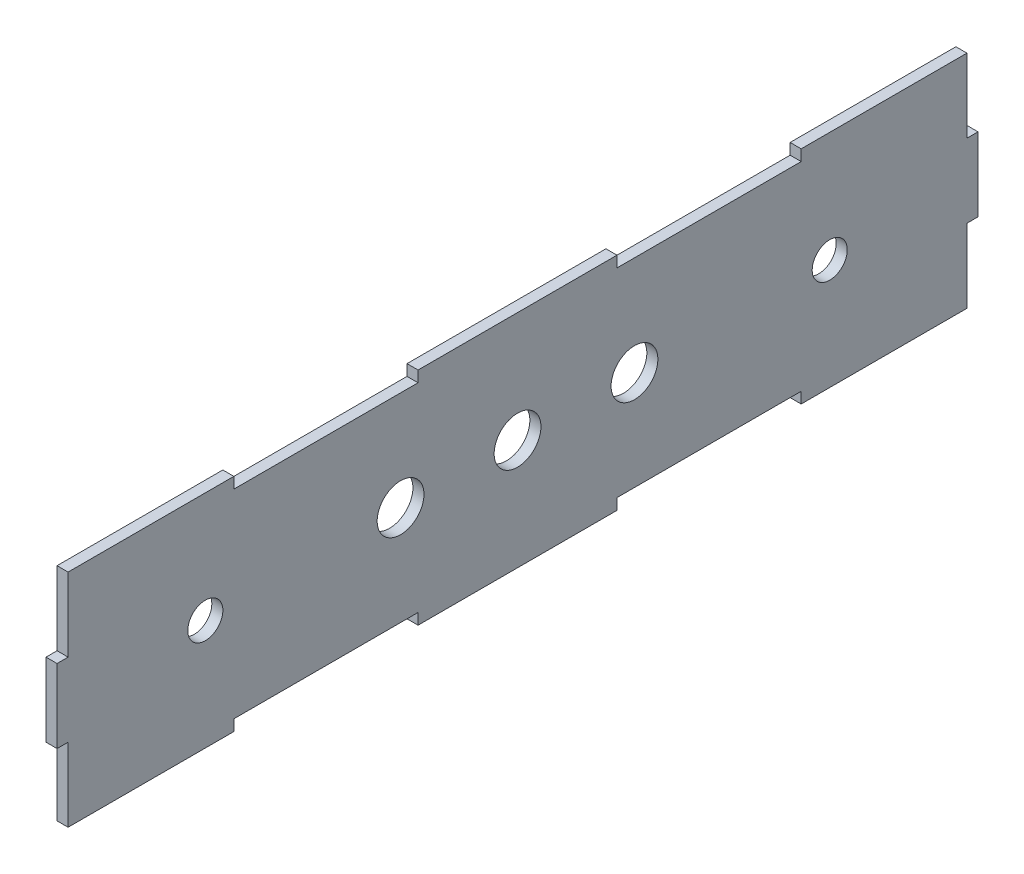
ISO-10303-21;
HEADER;
FILE_DESCRIPTION(('STEP AP214'),'2;1');
FILE_NAME('part.step','',(''),(''),'','','');
FILE_SCHEMA(('AUTOMOTIVE_DESIGN { 1 0 10303 214 1 1 1 1 }'));
ENDSEC;
DATA;
#1=APPLICATION_CONTEXT('core data for automotive mechanical design processes');
#2=APPLICATION_PROTOCOL_DEFINITION('international standard','automotive_design',2000,#1);
#3=PRODUCT_CONTEXT('',#1,'mechanical');
#4=PRODUCT('Part','Part','',(#3));
#5=PRODUCT_RELATED_PRODUCT_CATEGORY('part','',(#4));
#6=PRODUCT_DEFINITION_FORMATION('','',#4);
#7=PRODUCT_DEFINITION_CONTEXT('part definition',#1,'design');
#8=PRODUCT_DEFINITION('design','',#6,#7);
#9=PRODUCT_DEFINITION_SHAPE('','',#8);
#10=(LENGTH_UNIT() NAMED_UNIT(*) SI_UNIT(.MILLI.,.METRE.));
#11=(NAMED_UNIT(*) PLANE_ANGLE_UNIT() SI_UNIT($,.RADIAN.));
#12=(NAMED_UNIT(*) SI_UNIT($,.STERADIAN.) SOLID_ANGLE_UNIT());
#13=UNCERTAINTY_MEASURE_WITH_UNIT(LENGTH_MEASURE(1.E-05),#10,'distance_accuracy_value','');
#14=(GEOMETRIC_REPRESENTATION_CONTEXT(3) GLOBAL_UNCERTAINTY_ASSIGNED_CONTEXT((#13)) GLOBAL_UNIT_ASSIGNED_CONTEXT((#10,
#11,#12)) REPRESENTATION_CONTEXT('',''));
#15=CARTESIAN_POINT('',(0.,0.,0.));
#16=DIRECTION('',(0.,0.,1.));
#17=DIRECTION('',(1.,0.,0.));
#18=AXIS2_PLACEMENT_3D('',#15,#16,#17);
#19=CARTESIAN_POINT('',(3.,0.,27.));
#20=DIRECTION('',(0.,0.,-1.));
#21=DIRECTION('',(-1.,0.,0.));
#22=AXIS2_PLACEMENT_3D('',#19,#20,#21);
#23=PLANE('',#22);
#24=DIRECTION('',(0.,-1.,0.));
#25=VECTOR('',#24,1.);
#26=CARTESIAN_POINT('',(0.,0.,27.));
#27=LINE('',#26,#25);
#28=CARTESIAN_POINT('',(0.,-27.,27.));
#29=VERTEX_POINT('',#28);
#30=CARTESIAN_POINT('',(0.,-30.,27.));
#31=VERTEX_POINT('',#30);
#32=EDGE_CURVE('E262',#29,#31,#27,.T.);
#33=ORIENTED_EDGE('',*,*,#32,.T.);
#34=DIRECTION('',(-1.,0.,0.));
#35=VECTOR('',#34,1.);
#36=CARTESIAN_POINT('',(3.,-30.,27.));
#37=LINE('',#36,#35);
#38=CARTESIAN_POINT('',(3.,-30.,27.));
#39=VERTEX_POINT('',#38);
#40=EDGE_CURVE('E11',#39,#31,#37,.T.);
#41=ORIENTED_EDGE('',*,*,#40,.F.);
#42=DIRECTION('',(0.,-1.,0.));
#43=VECTOR('',#42,1.);
#44=CARTESIAN_POINT('',(3.,0.,27.));
#45=LINE('',#44,#43);
#46=CARTESIAN_POINT('',(3.,-27.,27.));
#47=VERTEX_POINT('',#46);
#48=EDGE_CURVE('E362',#47,#39,#45,.T.);
#49=ORIENTED_EDGE('',*,*,#48,.F.);
#50=DIRECTION('',(-1.,0.,0.));
#51=VECTOR('',#50,1.);
#52=CARTESIAN_POINT('',(3.,-27.,27.));
#53=LINE('',#52,#51);
#54=EDGE_CURVE('E258',#47,#29,#53,.T.);
#55=ORIENTED_EDGE('',*,*,#54,.T.);
#56=EDGE_LOOP('',(#33,#41,#49,#55));
#57=FACE_BOUND('',#56,.T.);
#58=ADVANCED_FACE('F41',(#57),#23,.F.);
#59=CARTESIAN_POINT('',(3.,-30.,0.));
#60=DIRECTION('',(0.,1.,0.));
#61=DIRECTION('',(0.,0.,1.));
#62=AXIS2_PLACEMENT_3D('',#59,#60,#61);
#63=PLANE('',#62);
#64=DIRECTION('',(0.,0.,-1.));
#65=VECTOR('',#64,1.);
#66=CARTESIAN_POINT('',(0.,-30.,0.));
#67=LINE('',#66,#65);
#68=CARTESIAN_POINT('',(0.,-30.,-27.));
#69=VERTEX_POINT('',#68);
#70=EDGE_CURVE('E266',#31,#69,#67,.T.);
#71=ORIENTED_EDGE('',*,*,#70,.T.);
#72=DIRECTION('',(-1.,0.,0.));
#73=VECTOR('',#72,1.);
#74=CARTESIAN_POINT('',(3.,-30.,-27.));
#75=LINE('',#74,#73);
#76=CARTESIAN_POINT('',(3.,-30.,-27.));
#77=VERTEX_POINT('',#76);
#78=EDGE_CURVE('E50',#77,#69,#75,.T.);
#79=ORIENTED_EDGE('',*,*,#78,.F.);
#80=DIRECTION('',(0.,0.,-1.));
#81=VECTOR('',#80,1.);
#82=CARTESIAN_POINT('',(3.,-30.,0.));
#83=LINE('',#82,#81);
#84=EDGE_CURVE('E161',#39,#77,#83,.T.);
#85=ORIENTED_EDGE('',*,*,#84,.F.);
#86=ORIENTED_EDGE('',*,*,#40,.T.);
#87=EDGE_LOOP('',(#71,#79,#85,#86));
#88=FACE_BOUND('',#87,.T.);
#89=ADVANCED_FACE('F568',(#88),#63,.F.);
#90=CARTESIAN_POINT('',(3.,0.,-27.));
#91=DIRECTION('',(0.,0.,1.));
#92=DIRECTION('',(1.,0.,0.));
#93=AXIS2_PLACEMENT_3D('',#90,#91,#92);
#94=PLANE('',#93);
#95=DIRECTION('',(0.,1.,0.));
#96=VECTOR('',#95,1.);
#97=CARTESIAN_POINT('',(0.,0.,-27.));
#98=LINE('',#97,#96);
#99=CARTESIAN_POINT('',(0.,-27.,-27.));
#100=VERTEX_POINT('',#99);
#101=EDGE_CURVE('E270',#69,#100,#98,.T.);
#102=ORIENTED_EDGE('',*,*,#101,.T.);
#103=DIRECTION('',(-1.,0.,0.));
#104=VECTOR('',#103,1.);
#105=CARTESIAN_POINT('',(3.,-27.,-27.));
#106=LINE('',#105,#104);
#107=CARTESIAN_POINT('',(3.,-27.,-27.));
#108=VERTEX_POINT('',#107);
#109=EDGE_CURVE('E436',#108,#100,#106,.T.);
#110=ORIENTED_EDGE('',*,*,#109,.F.);
#111=DIRECTION('',(0.,1.,0.));
#112=VECTOR('',#111,1.);
#113=CARTESIAN_POINT('',(3.,0.,-27.));
#114=LINE('',#113,#112);
#115=EDGE_CURVE('E446',#77,#108,#114,.T.);
#116=ORIENTED_EDGE('',*,*,#115,.F.);
#117=ORIENTED_EDGE('',*,*,#78,.T.);
#118=EDGE_LOOP('',(#102,#110,#116,#117));
#119=FACE_BOUND('',#118,.T.);
#120=ADVANCED_FACE('F444',(#119),#94,.F.);
#121=CARTESIAN_POINT('',(3.,-27.,0.));
#122=DIRECTION('',(0.,1.,0.));
#123=DIRECTION('',(0.,0.,1.));
#124=AXIS2_PLACEMENT_3D('',#121,#122,#123);
#125=PLANE('',#124);
#126=DIRECTION('',(0.,0.,-1.));
#127=VECTOR('',#126,1.);
#128=CARTESIAN_POINT('',(0.,-27.,0.));
#129=LINE('',#128,#127);
#130=CARTESIAN_POINT('',(0.,-27.,-77.));
#131=VERTEX_POINT('',#130);
#132=EDGE_CURVE('E273',#100,#131,#129,.T.);
#133=ORIENTED_EDGE('',*,*,#132,.T.);
#134=DIRECTION('',(-1.,0.,0.));
#135=VECTOR('',#134,1.);
#136=CARTESIAN_POINT('',(3.,-27.,-77.));
#137=LINE('',#136,#135);
#138=CARTESIAN_POINT('',(3.,-27.,-77.));
#139=VERTEX_POINT('',#138);
#140=EDGE_CURVE('E432',#139,#131,#137,.T.);
#141=ORIENTED_EDGE('',*,*,#140,.F.);
#142=DIRECTION('',(0.,0.,-1.));
#143=VECTOR('',#142,1.);
#144=CARTESIAN_POINT('',(3.,-27.,0.));
#145=LINE('',#144,#143);
#146=EDGE_CURVE('E465',#108,#139,#145,.T.);
#147=ORIENTED_EDGE('',*,*,#146,.F.);
#148=ORIENTED_EDGE('',*,*,#109,.T.);
#149=EDGE_LOOP('',(#133,#141,#147,#148));
#150=FACE_BOUND('',#149,.T.);
#151=ADVANCED_FACE('F455',(#150),#125,.F.);
#152=CARTESIAN_POINT('',(3.,0.,-77.));
#153=DIRECTION('',(0.,0.,-1.));
#154=DIRECTION('',(-1.,0.,0.));
#155=AXIS2_PLACEMENT_3D('',#152,#153,#154);
#156=PLANE('',#155);
#157=DIRECTION('',(0.,-1.,0.));
#158=VECTOR('',#157,1.);
#159=CARTESIAN_POINT('',(0.,0.,-77.));
#160=LINE('',#159,#158);
#161=CARTESIAN_POINT('',(0.,-30.,-77.));
#162=VERTEX_POINT('',#161);
#163=EDGE_CURVE('E276',#131,#162,#160,.T.);
#164=ORIENTED_EDGE('',*,*,#163,.T.);
#165=DIRECTION('',(-1.,0.,0.));
#166=VECTOR('',#165,1.);
#167=CARTESIAN_POINT('',(3.,-30.,-77.));
#168=LINE('',#167,#166);
#169=CARTESIAN_POINT('',(3.,-30.,-77.));
#170=VERTEX_POINT('',#169);
#171=EDGE_CURVE('E428',#170,#162,#168,.T.);
#172=ORIENTED_EDGE('',*,*,#171,.F.);
#173=DIRECTION('',(0.,-1.,0.));
#174=VECTOR('',#173,1.);
#175=CARTESIAN_POINT('',(3.,0.,-77.));
#176=LINE('',#175,#174);
#177=EDGE_CURVE('E461',#139,#170,#176,.T.);
#178=ORIENTED_EDGE('',*,*,#177,.F.);
#179=ORIENTED_EDGE('',*,*,#140,.T.);
#180=EDGE_LOOP('',(#164,#172,#178,#179));
#181=FACE_BOUND('',#180,.T.);
#182=ADVANCED_FACE('F459',(#181),#156,.F.);
#183=CARTESIAN_POINT('',(3.,-30.0000000000002,0.));
#184=DIRECTION('',(0.,1.,0.));
#185=DIRECTION('',(0.,0.,1.));
#186=AXIS2_PLACEMENT_3D('',#183,#184,#185);
#187=PLANE('',#186);
#188=DIRECTION('',(0.,0.,-1.));
#189=VECTOR('',#188,1.);
#190=CARTESIAN_POINT('',(0.,-30.0000000000002,0.));
#191=LINE('',#190,#189);
#192=CARTESIAN_POINT('',(0.,-29.9999999999999,-122.));
#193=VERTEX_POINT('',#192);
#194=EDGE_CURVE('E279',#162,#193,#191,.T.);
#195=ORIENTED_EDGE('',*,*,#194,.T.);
#196=DIRECTION('',(-1.,0.,0.));
#197=VECTOR('',#196,1.);
#198=CARTESIAN_POINT('',(3.,-29.9999999999999,-122.));
#199=LINE('',#198,#197);
#200=CARTESIAN_POINT('',(3.,-29.9999999999999,-122.));
#201=VERTEX_POINT('',#200);
#202=EDGE_CURVE('E425',#201,#193,#199,.T.);
#203=ORIENTED_EDGE('',*,*,#202,.F.);
#204=DIRECTION('',(0.,0.,-1.));
#205=VECTOR('',#204,1.);
#206=CARTESIAN_POINT('',(3.,-30.0000000000002,0.));
#207=LINE('',#206,#205);
#208=EDGE_CURVE('E464',#170,#201,#207,.T.);
#209=ORIENTED_EDGE('',*,*,#208,.F.);
#210=ORIENTED_EDGE('',*,*,#171,.T.);
#211=EDGE_LOOP('',(#195,#203,#209,#210));
#212=FACE_BOUND('',#211,.T.);
#213=ADVANCED_FACE('F581',(#212),#187,.F.);
#214=CARTESIAN_POINT('',(3.,0.,-122.));
#215=DIRECTION('',(0.,0.,-1.));
#216=DIRECTION('',(-1.,0.,0.));
#217=AXIS2_PLACEMENT_3D('',#214,#215,#216);
#218=PLANE('',#217);
#219=DIRECTION('',(0.,-1.,0.));
#220=VECTOR('',#219,1.);
#221=CARTESIAN_POINT('',(0.,0.,-122.));
#222=LINE('',#221,#220);
#223=CARTESIAN_POINT('',(0.,-10.,-122.));
#224=VERTEX_POINT('',#223);
#225=EDGE_CURVE('E283',#224,#193,#222,.T.);
#226=ORIENTED_EDGE('',*,*,#225,.F.);
#227=DIRECTION('',(-1.,0.,0.));
#228=VECTOR('',#227,1.);
#229=CARTESIAN_POINT('',(3.,-10.,-122.));
#230=LINE('',#229,#228);
#231=CARTESIAN_POINT('',(3.,-10.,-122.));
#232=VERTEX_POINT('',#231);
#233=EDGE_CURVE('E422',#232,#224,#230,.T.);
#234=ORIENTED_EDGE('',*,*,#233,.F.);
#235=DIRECTION('',(0.,-1.,0.));
#236=VECTOR('',#235,1.);
#237=CARTESIAN_POINT('',(3.,0.,-122.));
#238=LINE('',#237,#236);
#239=EDGE_CURVE('E469',#232,#201,#238,.T.);
#240=ORIENTED_EDGE('',*,*,#239,.T.);
#241=ORIENTED_EDGE('',*,*,#202,.T.);
#242=EDGE_LOOP('',(#226,#234,#240,#241));
#243=FACE_BOUND('',#242,.T.);
#244=ADVANCED_FACE('F584',(#243),#218,.T.);
#245=CARTESIAN_POINT('',(3.,-10.0000000000001,0.));
#246=DIRECTION('',(0.,-1.,0.));
#247=DIRECTION('',(0.,0.,-1.));
#248=AXIS2_PLACEMENT_3D('',#245,#246,#247);
#249=PLANE('',#248);
#250=DIRECTION('',(0.,0.,1.));
#251=VECTOR('',#250,1.);
#252=CARTESIAN_POINT('',(0.,-10.0000000000001,0.));
#253=LINE('',#252,#251);
#254=CARTESIAN_POINT('',(0.,-10.,-125.));
#255=VERTEX_POINT('',#254);
#256=EDGE_CURVE('E287',#255,#224,#253,.T.);
#257=ORIENTED_EDGE('',*,*,#256,.F.);
#258=DIRECTION('',(-1.,0.,0.));
#259=VECTOR('',#258,1.);
#260=CARTESIAN_POINT('',(3.,-10.,-125.));
#261=LINE('',#260,#259);
#262=CARTESIAN_POINT('',(3.,-10.,-125.));
#263=VERTEX_POINT('',#262);
#264=EDGE_CURVE('E419',#263,#255,#261,.T.);
#265=ORIENTED_EDGE('',*,*,#264,.F.);
#266=DIRECTION('',(0.,0.,1.));
#267=VECTOR('',#266,1.);
#268=CARTESIAN_POINT('',(3.,-10.0000000000001,0.));
#269=LINE('',#268,#267);
#270=EDGE_CURVE('E477',#263,#232,#269,.T.);
#271=ORIENTED_EDGE('',*,*,#270,.T.);
#272=ORIENTED_EDGE('',*,*,#233,.T.);
#273=EDGE_LOOP('',(#257,#265,#271,#272));
#274=FACE_BOUND('',#273,.T.);
#275=ADVANCED_FACE('F588',(#274),#249,.T.);
#276=CARTESIAN_POINT('',(3.,0.,-125.));
#277=DIRECTION('',(0.,0.,-1.));
#278=DIRECTION('',(-1.,0.,0.));
#279=AXIS2_PLACEMENT_3D('',#276,#277,#278);
#280=PLANE('',#279);
#281=DIRECTION('',(0.,-1.,0.));
#282=VECTOR('',#281,1.);
#283=CARTESIAN_POINT('',(0.,0.,-125.));
#284=LINE('',#283,#282);
#285=CARTESIAN_POINT('',(0.,10.,-125.));
#286=VERTEX_POINT('',#285);
#287=EDGE_CURVE('E291',#286,#255,#284,.T.);
#288=ORIENTED_EDGE('',*,*,#287,.F.);
#289=DIRECTION('',(-1.,0.,0.));
#290=VECTOR('',#289,1.);
#291=CARTESIAN_POINT('',(3.,10.,-125.));
#292=LINE('',#291,#290);
#293=CARTESIAN_POINT('',(3.,10.,-125.));
#294=VERTEX_POINT('',#293);
#295=EDGE_CURVE('E416',#294,#286,#292,.T.);
#296=ORIENTED_EDGE('',*,*,#295,.F.);
#297=DIRECTION('',(0.,-1.,0.));
#298=VECTOR('',#297,1.);
#299=CARTESIAN_POINT('',(3.,0.,-125.));
#300=LINE('',#299,#298);
#301=EDGE_CURVE('E481',#294,#263,#300,.T.);
#302=ORIENTED_EDGE('',*,*,#301,.T.);
#303=ORIENTED_EDGE('',*,*,#264,.T.);
#304=EDGE_LOOP('',(#288,#296,#302,#303));
#305=FACE_BOUND('',#304,.T.);
#306=ADVANCED_FACE('F592',(#305),#280,.T.);
#307=CARTESIAN_POINT('',(3.,10.0000000000001,0.));
#308=DIRECTION('',(0.,1.,0.));
#309=DIRECTION('',(0.,0.,1.));
#310=AXIS2_PLACEMENT_3D('',#307,#308,#309);
#311=PLANE('',#310);
#312=DIRECTION('',(0.,0.,-1.));
#313=VECTOR('',#312,1.);
#314=CARTESIAN_POINT('',(0.,10.0000000000001,0.));
#315=LINE('',#314,#313);
#316=CARTESIAN_POINT('',(0.,10.,-122.));
#317=VERTEX_POINT('',#316);
#318=EDGE_CURVE('E295',#317,#286,#315,.T.);
#319=ORIENTED_EDGE('',*,*,#318,.F.);
#320=DIRECTION('',(-1.,0.,0.));
#321=VECTOR('',#320,1.);
#322=CARTESIAN_POINT('',(3.,10.,-122.));
#323=LINE('',#322,#321);
#324=CARTESIAN_POINT('',(3.,10.,-122.));
#325=VERTEX_POINT('',#324);
#326=EDGE_CURVE('E413',#325,#317,#323,.T.);
#327=ORIENTED_EDGE('',*,*,#326,.F.);
#328=DIRECTION('',(0.,0.,-1.));
#329=VECTOR('',#328,1.);
#330=CARTESIAN_POINT('',(3.,10.0000000000001,0.));
#331=LINE('',#330,#329);
#332=EDGE_CURVE('E485',#325,#294,#331,.T.);
#333=ORIENTED_EDGE('',*,*,#332,.T.);
#334=ORIENTED_EDGE('',*,*,#295,.T.);
#335=EDGE_LOOP('',(#319,#327,#333,#334));
#336=FACE_BOUND('',#335,.T.);
#337=ADVANCED_FACE('F596',(#336),#311,.T.);
#338=CARTESIAN_POINT('',(3.,0.,-122.));
#339=DIRECTION('',(0.,0.,-1.));
#340=DIRECTION('',(0.,1.,0.));
#341=AXIS2_PLACEMENT_3D('',#338,#339,#340);
#342=PLANE('',#341);
#343=DIRECTION('',(0.,-1.,0.));
#344=VECTOR('',#343,1.);
#345=CARTESIAN_POINT('',(0.,0.,-122.));
#346=LINE('',#345,#344);
#347=CARTESIAN_POINT('',(0.,30.,-122.));
#348=VERTEX_POINT('',#347);
#349=EDGE_CURVE('E299',#348,#317,#346,.T.);
#350=ORIENTED_EDGE('',*,*,#349,.F.);
#351=DIRECTION('',(-1.,0.,0.));
#352=VECTOR('',#351,1.);
#353=CARTESIAN_POINT('',(3.,30.,-122.));
#354=LINE('',#353,#352);
#355=CARTESIAN_POINT('',(3.,30.,-122.));
#356=VERTEX_POINT('',#355);
#357=EDGE_CURVE('E410',#356,#348,#354,.T.);
#358=ORIENTED_EDGE('',*,*,#357,.F.);
#359=DIRECTION('',(0.,-1.,0.));
#360=VECTOR('',#359,1.);
#361=CARTESIAN_POINT('',(3.,0.,-122.));
#362=LINE('',#361,#360);
#363=EDGE_CURVE('E489',#356,#325,#362,.T.);
#364=ORIENTED_EDGE('',*,*,#363,.T.);
#365=ORIENTED_EDGE('',*,*,#326,.T.);
#366=EDGE_LOOP('',(#350,#358,#364,#365));
#367=FACE_BOUND('',#366,.T.);
#368=ADVANCED_FACE('F600',(#367),#342,.T.);
#369=CARTESIAN_POINT('',(3.,30.,0.));
#370=DIRECTION('',(0.,1.,0.));
#371=DIRECTION('',(0.,0.,1.));
#372=AXIS2_PLACEMENT_3D('',#369,#370,#371);
#373=PLANE('',#372);
#374=DIRECTION('',(0.,0.,-1.));
#375=VECTOR('',#374,1.);
#376=CARTESIAN_POINT('',(0.,30.,0.));
#377=LINE('',#376,#375);
#378=CARTESIAN_POINT('',(0.,30.,-77.));
#379=VERTEX_POINT('',#378);
#380=EDGE_CURVE('E303',#379,#348,#377,.T.);
#381=ORIENTED_EDGE('',*,*,#380,.F.);
#382=DIRECTION('',(-1.,0.,0.));
#383=VECTOR('',#382,1.);
#384=CARTESIAN_POINT('',(3.,30.,-77.));
#385=LINE('',#384,#383);
#386=CARTESIAN_POINT('',(3.,30.,-77.));
#387=VERTEX_POINT('',#386);
#388=EDGE_CURVE('E407',#387,#379,#385,.T.);
#389=ORIENTED_EDGE('',*,*,#388,.F.);
#390=DIRECTION('',(0.,0.,-1.));
#391=VECTOR('',#390,1.);
#392=CARTESIAN_POINT('',(3.,30.,0.));
#393=LINE('',#392,#391);
#394=EDGE_CURVE('E493',#387,#356,#393,.T.);
#395=ORIENTED_EDGE('',*,*,#394,.T.);
#396=ORIENTED_EDGE('',*,*,#357,.T.);
#397=EDGE_LOOP('',(#381,#389,#395,#396));
#398=FACE_BOUND('',#397,.T.);
#399=ADVANCED_FACE('F604',(#398),#373,.T.);
#400=CARTESIAN_POINT('',(3.,0.,-77.));
#401=DIRECTION('',(0.,0.,1.));
#402=DIRECTION('',(1.,0.,0.));
#403=AXIS2_PLACEMENT_3D('',#400,#401,#402);
#404=PLANE('',#403);
#405=DIRECTION('',(0.,1.,0.));
#406=VECTOR('',#405,1.);
#407=CARTESIAN_POINT('',(0.,0.,-77.));
#408=LINE('',#407,#406);
#409=CARTESIAN_POINT('',(0.,27.,-77.));
#410=VERTEX_POINT('',#409);
#411=EDGE_CURVE('E307',#410,#379,#408,.T.);
#412=ORIENTED_EDGE('',*,*,#411,.F.);
#413=DIRECTION('',(-1.,0.,0.));
#414=VECTOR('',#413,1.);
#415=CARTESIAN_POINT('',(3.,27.,-77.));
#416=LINE('',#415,#414);
#417=CARTESIAN_POINT('',(3.,27.,-77.));
#418=VERTEX_POINT('',#417);
#419=EDGE_CURVE('E404',#418,#410,#416,.T.);
#420=ORIENTED_EDGE('',*,*,#419,.F.);
#421=DIRECTION('',(0.,1.,0.));
#422=VECTOR('',#421,1.);
#423=CARTESIAN_POINT('',(3.,0.,-77.));
#424=LINE('',#423,#422);
#425=EDGE_CURVE('E497',#418,#387,#424,.T.);
#426=ORIENTED_EDGE('',*,*,#425,.T.);
#427=ORIENTED_EDGE('',*,*,#388,.T.);
#428=EDGE_LOOP('',(#412,#420,#426,#427));
#429=FACE_BOUND('',#428,.T.);
#430=ADVANCED_FACE('F608',(#429),#404,.T.);
#431=CARTESIAN_POINT('',(3.,27.,0.));
#432=DIRECTION('',(0.,1.,0.));
#433=DIRECTION('',(0.,0.,1.));
#434=AXIS2_PLACEMENT_3D('',#431,#432,#433);
#435=PLANE('',#434);
#436=DIRECTION('',(0.,0.,-1.));
#437=VECTOR('',#436,1.);
#438=CARTESIAN_POINT('',(0.,27.,0.));
#439=LINE('',#438,#437);
#440=CARTESIAN_POINT('',(0.,27.,-27.));
#441=VERTEX_POINT('',#440);
#442=EDGE_CURVE('E311',#441,#410,#439,.T.);
#443=ORIENTED_EDGE('',*,*,#442,.F.);
#444=DIRECTION('',(-1.,0.,0.));
#445=VECTOR('',#444,1.);
#446=CARTESIAN_POINT('',(3.,27.,-27.));
#447=LINE('',#446,#445);
#448=CARTESIAN_POINT('',(3.,27.,-27.));
#449=VERTEX_POINT('',#448);
#450=EDGE_CURVE('E401',#449,#441,#447,.T.);
#451=ORIENTED_EDGE('',*,*,#450,.F.);
#452=DIRECTION('',(0.,0.,-1.));
#453=VECTOR('',#452,1.);
#454=CARTESIAN_POINT('',(3.,27.,0.));
#455=LINE('',#454,#453);
#456=EDGE_CURVE('E501',#449,#418,#455,.T.);
#457=ORIENTED_EDGE('',*,*,#456,.T.);
#458=ORIENTED_EDGE('',*,*,#419,.T.);
#459=EDGE_LOOP('',(#443,#451,#457,#458));
#460=FACE_BOUND('',#459,.T.);
#461=ADVANCED_FACE('F612',(#460),#435,.T.);
#462=CARTESIAN_POINT('',(3.,0.,-27.));
#463=DIRECTION('',(0.,0.,-1.));
#464=DIRECTION('',(-1.,0.,0.));
#465=AXIS2_PLACEMENT_3D('',#462,#463,#464);
#466=PLANE('',#465);
#467=DIRECTION('',(0.,-1.,0.));
#468=VECTOR('',#467,1.);
#469=CARTESIAN_POINT('',(0.,0.,-27.));
#470=LINE('',#469,#468);
#471=CARTESIAN_POINT('',(0.,30.,-27.));
#472=VERTEX_POINT('',#471);
#473=EDGE_CURVE('E315',#472,#441,#470,.T.);
#474=ORIENTED_EDGE('',*,*,#473,.F.);
#475=DIRECTION('',(-1.,0.,0.));
#476=VECTOR('',#475,1.);
#477=CARTESIAN_POINT('',(3.,30.,-27.));
#478=LINE('',#477,#476);
#479=CARTESIAN_POINT('',(3.,30.,-27.));
#480=VERTEX_POINT('',#479);
#481=EDGE_CURVE('E398',#480,#472,#478,.T.);
#482=ORIENTED_EDGE('',*,*,#481,.F.);
#483=DIRECTION('',(0.,-1.,0.));
#484=VECTOR('',#483,1.);
#485=CARTESIAN_POINT('',(3.,0.,-27.));
#486=LINE('',#485,#484);
#487=EDGE_CURVE('E505',#480,#449,#486,.T.);
#488=ORIENTED_EDGE('',*,*,#487,.T.);
#489=ORIENTED_EDGE('',*,*,#450,.T.);
#490=EDGE_LOOP('',(#474,#482,#488,#489));
#491=FACE_BOUND('',#490,.T.);
#492=ADVANCED_FACE('F616',(#491),#466,.T.);
#493=CARTESIAN_POINT('',(3.,30.,0.));
#494=DIRECTION('',(0.,1.,0.));
#495=DIRECTION('',(0.,0.,1.));
#496=AXIS2_PLACEMENT_3D('',#493,#494,#495);
#497=PLANE('',#496);
#498=DIRECTION('',(0.,0.,-1.));
#499=VECTOR('',#498,1.);
#500=CARTESIAN_POINT('',(0.,30.,0.));
#501=LINE('',#500,#499);
#502=CARTESIAN_POINT('',(0.,30.,27.));
#503=VERTEX_POINT('',#502);
#504=EDGE_CURVE('E319',#503,#472,#501,.T.);
#505=ORIENTED_EDGE('',*,*,#504,.F.);
#506=DIRECTION('',(-1.,0.,0.));
#507=VECTOR('',#506,1.);
#508=CARTESIAN_POINT('',(3.,30.,27.));
#509=LINE('',#508,#507);
#510=CARTESIAN_POINT('',(3.,30.,27.));
#511=VERTEX_POINT('',#510);
#512=EDGE_CURVE('E395',#511,#503,#509,.T.);
#513=ORIENTED_EDGE('',*,*,#512,.F.);
#514=DIRECTION('',(0.,0.,-1.));
#515=VECTOR('',#514,1.);
#516=CARTESIAN_POINT('',(3.,30.,0.));
#517=LINE('',#516,#515);
#518=EDGE_CURVE('E509',#511,#480,#517,.T.);
#519=ORIENTED_EDGE('',*,*,#518,.T.);
#520=ORIENTED_EDGE('',*,*,#481,.T.);
#521=EDGE_LOOP('',(#505,#513,#519,#520));
#522=FACE_BOUND('',#521,.T.);
#523=ADVANCED_FACE('F620',(#522),#497,.T.);
#524=CARTESIAN_POINT('',(3.,0.,27.));
#525=DIRECTION('',(0.,0.,1.));
#526=DIRECTION('',(1.,0.,0.));
#527=AXIS2_PLACEMENT_3D('',#524,#525,#526);
#528=PLANE('',#527);
#529=DIRECTION('',(0.,1.,0.));
#530=VECTOR('',#529,1.);
#531=CARTESIAN_POINT('',(0.,0.,27.));
#532=LINE('',#531,#530);
#533=CARTESIAN_POINT('',(0.,27.,27.));
#534=VERTEX_POINT('',#533);
#535=EDGE_CURVE('E323',#534,#503,#532,.T.);
#536=ORIENTED_EDGE('',*,*,#535,.F.);
#537=DIRECTION('',(-1.,0.,0.));
#538=VECTOR('',#537,1.);
#539=CARTESIAN_POINT('',(3.,27.,27.));
#540=LINE('',#539,#538);
#541=CARTESIAN_POINT('',(3.,27.,27.));
#542=VERTEX_POINT('',#541);
#543=EDGE_CURVE('E392',#542,#534,#540,.T.);
#544=ORIENTED_EDGE('',*,*,#543,.F.);
#545=DIRECTION('',(0.,1.,0.));
#546=VECTOR('',#545,1.);
#547=CARTESIAN_POINT('',(3.,0.,27.));
#548=LINE('',#547,#546);
#549=EDGE_CURVE('E513',#542,#511,#548,.T.);
#550=ORIENTED_EDGE('',*,*,#549,.T.);
#551=ORIENTED_EDGE('',*,*,#512,.T.);
#552=EDGE_LOOP('',(#536,#544,#550,#551));
#553=FACE_BOUND('',#552,.T.);
#554=ADVANCED_FACE('F624',(#553),#528,.T.);
#555=CARTESIAN_POINT('',(3.,27.,0.));
#556=DIRECTION('',(0.,1.,0.));
#557=DIRECTION('',(0.,0.,1.));
#558=AXIS2_PLACEMENT_3D('',#555,#556,#557);
#559=PLANE('',#558);
#560=DIRECTION('',(0.,0.,-1.));
#561=VECTOR('',#560,1.);
#562=CARTESIAN_POINT('',(0.,27.,0.));
#563=LINE('',#562,#561);
#564=CARTESIAN_POINT('',(0.,27.,77.));
#565=VERTEX_POINT('',#564);
#566=EDGE_CURVE('E327',#565,#534,#563,.T.);
#567=ORIENTED_EDGE('',*,*,#566,.F.);
#568=DIRECTION('',(-1.,0.,0.));
#569=VECTOR('',#568,1.);
#570=CARTESIAN_POINT('',(3.,27.,77.));
#571=LINE('',#570,#569);
#572=CARTESIAN_POINT('',(3.,27.,77.));
#573=VERTEX_POINT('',#572);
#574=EDGE_CURVE('E389',#573,#565,#571,.T.);
#575=ORIENTED_EDGE('',*,*,#574,.F.);
#576=DIRECTION('',(0.,0.,-1.));
#577=VECTOR('',#576,1.);
#578=CARTESIAN_POINT('',(3.,27.,0.));
#579=LINE('',#578,#577);
#580=EDGE_CURVE('E517',#573,#542,#579,.T.);
#581=ORIENTED_EDGE('',*,*,#580,.T.);
#582=ORIENTED_EDGE('',*,*,#543,.T.);
#583=EDGE_LOOP('',(#567,#575,#581,#582));
#584=FACE_BOUND('',#583,.T.);
#585=ADVANCED_FACE('F628',(#584),#559,.T.);
#586=CARTESIAN_POINT('',(3.,-3.56196553733904E-13,76.9999999999999));
#587=DIRECTION('',(0.,0.,-1.));
#588=DIRECTION('',(0.,1.,0.));
#589=AXIS2_PLACEMENT_3D('',#586,#587,#588);
#590=PLANE('',#589);
#591=DIRECTION('',(0.,-1.,0.));
#592=VECTOR('',#591,1.);
#593=CARTESIAN_POINT('',(0.,-3.56196553733904E-13,76.9999999999999));
#594=LINE('',#593,#592);
#595=CARTESIAN_POINT('',(0.,30.,77.));
#596=VERTEX_POINT('',#595);
#597=EDGE_CURVE('E331',#596,#565,#594,.T.);
#598=ORIENTED_EDGE('',*,*,#597,.F.);
#599=DIRECTION('',(-1.,0.,0.));
#600=VECTOR('',#599,1.);
#601=CARTESIAN_POINT('',(3.,30.,77.));
#602=LINE('',#601,#600);
#603=CARTESIAN_POINT('',(3.,30.,77.));
#604=VERTEX_POINT('',#603);
#605=EDGE_CURVE('E386',#604,#596,#602,.T.);
#606=ORIENTED_EDGE('',*,*,#605,.F.);
#607=DIRECTION('',(0.,-1.,0.));
#608=VECTOR('',#607,1.);
#609=CARTESIAN_POINT('',(3.,-3.56196553733904E-13,76.9999999999999));
#610=LINE('',#609,#608);
#611=EDGE_CURVE('E521',#604,#573,#610,.T.);
#612=ORIENTED_EDGE('',*,*,#611,.T.);
#613=ORIENTED_EDGE('',*,*,#574,.T.);
#614=EDGE_LOOP('',(#598,#606,#612,#613));
#615=FACE_BOUND('',#614,.T.);
#616=ADVANCED_FACE('F632',(#615),#590,.T.);
#617=CARTESIAN_POINT('',(3.,30.,0.));
#618=DIRECTION('',(0.,1.,0.));
#619=DIRECTION('',(0.,0.,1.));
#620=AXIS2_PLACEMENT_3D('',#617,#618,#619);
#621=PLANE('',#620);
#622=DIRECTION('',(0.,0.,-1.));
#623=VECTOR('',#622,1.);
#624=CARTESIAN_POINT('',(0.,30.,0.));
#625=LINE('',#624,#623);
#626=CARTESIAN_POINT('',(0.,30.,122.));
#627=VERTEX_POINT('',#626);
#628=EDGE_CURVE('E335',#627,#596,#625,.T.);
#629=ORIENTED_EDGE('',*,*,#628,.F.);
#630=DIRECTION('',(-1.,0.,0.));
#631=VECTOR('',#630,1.);
#632=CARTESIAN_POINT('',(3.,30.,122.));
#633=LINE('',#632,#631);
#634=CARTESIAN_POINT('',(3.,30.,122.));
#635=VERTEX_POINT('',#634);
#636=EDGE_CURVE('E383',#635,#627,#633,.T.);
#637=ORIENTED_EDGE('',*,*,#636,.F.);
#638=DIRECTION('',(0.,0.,-1.));
#639=VECTOR('',#638,1.);
#640=CARTESIAN_POINT('',(3.,30.,0.));
#641=LINE('',#640,#639);
#642=EDGE_CURVE('E525',#635,#604,#641,.T.);
#643=ORIENTED_EDGE('',*,*,#642,.T.);
#644=ORIENTED_EDGE('',*,*,#605,.T.);
#645=EDGE_LOOP('',(#629,#637,#643,#644));
#646=FACE_BOUND('',#645,.T.);
#647=ADVANCED_FACE('F636',(#646),#621,.T.);
#648=CARTESIAN_POINT('',(3.,0.,122.));
#649=DIRECTION('',(0.,0.,-1.));
#650=DIRECTION('',(0.,1.,0.));
#651=AXIS2_PLACEMENT_3D('',#648,#649,#650);
#652=PLANE('',#651);
#653=DIRECTION('',(0.,-1.,0.));
#654=VECTOR('',#653,1.);
#655=CARTESIAN_POINT('',(0.,0.,122.));
#656=LINE('',#655,#654);
#657=CARTESIAN_POINT('',(0.,10.,122.));
#658=VERTEX_POINT('',#657);
#659=EDGE_CURVE('E339',#627,#658,#656,.T.);
#660=ORIENTED_EDGE('',*,*,#659,.T.);
#661=DIRECTION('',(-1.,0.,0.));
#662=VECTOR('',#661,1.);
#663=CARTESIAN_POINT('',(3.,10.,122.));
#664=LINE('',#663,#662);
#665=CARTESIAN_POINT('',(3.,10.,122.));
#666=VERTEX_POINT('',#665);
#667=EDGE_CURVE('E380',#666,#658,#664,.T.);
#668=ORIENTED_EDGE('',*,*,#667,.F.);
#669=DIRECTION('',(0.,-1.,0.));
#670=VECTOR('',#669,1.);
#671=CARTESIAN_POINT('',(3.,0.,122.));
#672=LINE('',#671,#670);
#673=EDGE_CURVE('E529',#635,#666,#672,.T.);
#674=ORIENTED_EDGE('',*,*,#673,.F.);
#675=ORIENTED_EDGE('',*,*,#636,.T.);
#676=EDGE_LOOP('',(#660,#668,#674,#675));
#677=FACE_BOUND('',#676,.T.);
#678=ADVANCED_FACE('F640',(#677),#652,.F.);
#679=CARTESIAN_POINT('',(3.,10.0000000000001,0.));
#680=DIRECTION('',(0.,1.,0.));
#681=DIRECTION('',(0.,0.,1.));
#682=AXIS2_PLACEMENT_3D('',#679,#680,#681);
#683=PLANE('',#682);
#684=DIRECTION('',(0.,0.,-1.));
#685=VECTOR('',#684,1.);
#686=CARTESIAN_POINT('',(0.,10.0000000000001,0.));
#687=LINE('',#686,#685);
#688=CARTESIAN_POINT('',(0.,10.,125.));
#689=VERTEX_POINT('',#688);
#690=EDGE_CURVE('E343',#689,#658,#687,.T.);
#691=ORIENTED_EDGE('',*,*,#690,.F.);
#692=DIRECTION('',(-1.,0.,0.));
#693=VECTOR('',#692,1.);
#694=CARTESIAN_POINT('',(3.,10.,125.));
#695=LINE('',#694,#693);
#696=CARTESIAN_POINT('',(3.,10.,125.));
#697=VERTEX_POINT('',#696);
#698=EDGE_CURVE('E377',#697,#689,#695,.T.);
#699=ORIENTED_EDGE('',*,*,#698,.F.);
#700=DIRECTION('',(0.,0.,-1.));
#701=VECTOR('',#700,1.);
#702=CARTESIAN_POINT('',(3.,10.0000000000001,0.));
#703=LINE('',#702,#701);
#704=EDGE_CURVE('E532',#697,#666,#703,.T.);
#705=ORIENTED_EDGE('',*,*,#704,.T.);
#706=ORIENTED_EDGE('',*,*,#667,.T.);
#707=EDGE_LOOP('',(#691,#699,#705,#706));
#708=FACE_BOUND('',#707,.T.);
#709=ADVANCED_FACE('F644',(#708),#683,.T.);
#710=CARTESIAN_POINT('',(3.,0.,125.));
#711=DIRECTION('',(0.,0.,-1.));
#712=DIRECTION('',(-1.,0.,0.));
#713=AXIS2_PLACEMENT_3D('',#710,#711,#712);
#714=PLANE('',#713);
#715=DIRECTION('',(0.,-1.,0.));
#716=VECTOR('',#715,1.);
#717=CARTESIAN_POINT('',(0.,0.,125.));
#718=LINE('',#717,#716);
#719=CARTESIAN_POINT('',(0.,-10.,125.));
#720=VERTEX_POINT('',#719);
#721=EDGE_CURVE('E347',#689,#720,#718,.T.);
#722=ORIENTED_EDGE('',*,*,#721,.T.);
#723=DIRECTION('',(-1.,0.,0.));
#724=VECTOR('',#723,1.);
#725=CARTESIAN_POINT('',(3.,-10.,125.));
#726=LINE('',#725,#724);
#727=CARTESIAN_POINT('',(3.,-10.,125.));
#728=VERTEX_POINT('',#727);
#729=EDGE_CURVE('E373',#728,#720,#726,.T.);
#730=ORIENTED_EDGE('',*,*,#729,.F.);
#731=DIRECTION('',(0.,-1.,0.));
#732=VECTOR('',#731,1.);
#733=CARTESIAN_POINT('',(3.,0.,125.));
#734=LINE('',#733,#732);
#735=EDGE_CURVE('E536',#697,#728,#734,.T.);
#736=ORIENTED_EDGE('',*,*,#735,.F.);
#737=ORIENTED_EDGE('',*,*,#698,.T.);
#738=EDGE_LOOP('',(#722,#730,#736,#737));
#739=FACE_BOUND('',#738,.T.);
#740=ADVANCED_FACE('F648',(#739),#714,.F.);
#741=CARTESIAN_POINT('',(3.,-10.0000000000001,0.));
#742=DIRECTION('',(0.,1.,0.));
#743=DIRECTION('',(0.,0.,1.));
#744=AXIS2_PLACEMENT_3D('',#741,#742,#743);
#745=PLANE('',#744);
#746=DIRECTION('',(0.,0.,-1.));
#747=VECTOR('',#746,1.);
#748=CARTESIAN_POINT('',(0.,-10.0000000000001,0.));
#749=LINE('',#748,#747);
#750=CARTESIAN_POINT('',(0.,-10.,122.));
#751=VERTEX_POINT('',#750);
#752=EDGE_CURVE('E350',#720,#751,#749,.T.);
#753=ORIENTED_EDGE('',*,*,#752,.T.);
#754=DIRECTION('',(-1.,0.,0.));
#755=VECTOR('',#754,1.);
#756=CARTESIAN_POINT('',(3.,-10.,122.));
#757=LINE('',#756,#755);
#758=CARTESIAN_POINT('',(3.,-10.,122.));
#759=VERTEX_POINT('',#758);
#760=EDGE_CURVE('E369',#759,#751,#757,.T.);
#761=ORIENTED_EDGE('',*,*,#760,.F.);
#762=DIRECTION('',(0.,0.,-1.));
#763=VECTOR('',#762,1.);
#764=CARTESIAN_POINT('',(3.,-10.0000000000001,0.));
#765=LINE('',#764,#763);
#766=EDGE_CURVE('E539',#728,#759,#765,.T.);
#767=ORIENTED_EDGE('',*,*,#766,.F.);
#768=ORIENTED_EDGE('',*,*,#729,.T.);
#769=EDGE_LOOP('',(#753,#761,#767,#768));
#770=FACE_BOUND('',#769,.T.);
#771=ADVANCED_FACE('F548',(#770),#745,.F.);
#772=CARTESIAN_POINT('',(3.,0.,122.));
#773=DIRECTION('',(0.,0.,-1.));
#774=DIRECTION('',(-1.,0.,0.));
#775=AXIS2_PLACEMENT_3D('',#772,#773,#774);
#776=PLANE('',#775);
#777=DIRECTION('',(0.,-1.,0.));
#778=VECTOR('',#777,1.);
#779=CARTESIAN_POINT('',(0.,0.,122.));
#780=LINE('',#779,#778);
#781=CARTESIAN_POINT('',(0.,-29.9999999999999,122.));
#782=VERTEX_POINT('',#781);
#783=EDGE_CURVE('E353',#751,#782,#780,.T.);
#784=ORIENTED_EDGE('',*,*,#783,.T.);
#785=DIRECTION('',(-1.,0.,0.));
#786=VECTOR('',#785,1.);
#787=CARTESIAN_POINT('',(3.,-29.9999999999999,122.));
#788=LINE('',#787,#786);
#789=CARTESIAN_POINT('',(3.,-29.9999999999999,122.));
#790=VERTEX_POINT('',#789);
#791=EDGE_CURVE('E251',#790,#782,#788,.T.);
#792=ORIENTED_EDGE('',*,*,#791,.F.);
#793=DIRECTION('',(0.,-1.,0.));
#794=VECTOR('',#793,1.);
#795=CARTESIAN_POINT('',(3.,0.,122.));
#796=LINE('',#795,#794);
#797=EDGE_CURVE('E240',#759,#790,#796,.T.);
#798=ORIENTED_EDGE('',*,*,#797,.F.);
#799=ORIENTED_EDGE('',*,*,#760,.T.);
#800=EDGE_LOOP('',(#784,#792,#798,#799));
#801=FACE_BOUND('',#800,.T.);
#802=ADVANCED_FACE('F552',(#801),#776,.F.);
#803=CARTESIAN_POINT('',(3.,-30.0000000000001,0.));
#804=DIRECTION('',(0.,1.,0.));
#805=DIRECTION('',(0.,0.,1.));
#806=AXIS2_PLACEMENT_3D('',#803,#804,#805);
#807=PLANE('',#806);
#808=DIRECTION('',(0.,0.,-1.));
#809=VECTOR('',#808,1.);
#810=CARTESIAN_POINT('',(0.,-30.0000000000001,0.));
#811=LINE('',#810,#809);
#812=CARTESIAN_POINT('',(0.,-30.,77.));
#813=VERTEX_POINT('',#812);
#814=EDGE_CURVE('E249',#782,#813,#811,.T.);
#815=ORIENTED_EDGE('',*,*,#814,.T.);
#816=DIRECTION('',(-1.,0.,0.));
#817=VECTOR('',#816,1.);
#818=CARTESIAN_POINT('',(3.,-30.,77.));
#819=LINE('',#818,#817);
#820=CARTESIAN_POINT('',(3.,-30.,77.));
#821=VERTEX_POINT('',#820);
#822=EDGE_CURVE('E246',#821,#813,#819,.T.);
#823=ORIENTED_EDGE('',*,*,#822,.F.);
#824=DIRECTION('',(0.,0.,-1.));
#825=VECTOR('',#824,1.);
#826=CARTESIAN_POINT('',(3.,-30.0000000000001,0.));
#827=LINE('',#826,#825);
#828=EDGE_CURVE('E234',#790,#821,#827,.T.);
#829=ORIENTED_EDGE('',*,*,#828,.F.);
#830=ORIENTED_EDGE('',*,*,#791,.T.);
#831=EDGE_LOOP('',(#815,#823,#829,#830));
#832=FACE_BOUND('',#831,.T.);
#833=ADVANCED_FACE('F247',(#832),#807,.F.);
#834=CARTESIAN_POINT('',(3.,3.56196553733904E-13,76.9999999999999));
#835=DIRECTION('',(0.,0.,1.));
#836=DIRECTION('',(0.,-1.,0.));
#837=AXIS2_PLACEMENT_3D('',#834,#835,#836);
#838=PLANE('',#837);
#839=DIRECTION('',(0.,1.,0.));
#840=VECTOR('',#839,1.);
#841=CARTESIAN_POINT('',(0.,3.56196553733904E-13,76.9999999999999));
#842=LINE('',#841,#840);
#843=CARTESIAN_POINT('',(0.,-27.,77.));
#844=VERTEX_POINT('',#843);
#845=EDGE_CURVE('E147',#813,#844,#842,.T.);
#846=ORIENTED_EDGE('',*,*,#845,.T.);
#847=DIRECTION('',(-1.,0.,0.));
#848=VECTOR('',#847,1.);
#849=CARTESIAN_POINT('',(3.,-27.,77.));
#850=LINE('',#849,#848);
#851=CARTESIAN_POINT('',(3.,-27.,77.));
#852=VERTEX_POINT('',#851);
#853=EDGE_CURVE('E252',#852,#844,#850,.T.);
#854=ORIENTED_EDGE('',*,*,#853,.F.);
#855=DIRECTION('',(0.,1.,0.));
#856=VECTOR('',#855,1.);
#857=CARTESIAN_POINT('',(3.,3.56196553733904E-13,76.9999999999999));
#858=LINE('',#857,#856);
#859=EDGE_CURVE('E238',#821,#852,#858,.T.);
#860=ORIENTED_EDGE('',*,*,#859,.F.);
#861=ORIENTED_EDGE('',*,*,#822,.T.);
#862=EDGE_LOOP('',(#846,#854,#860,#861));
#863=FACE_BOUND('',#862,.T.);
#864=ADVANCED_FACE('F254',(#863),#838,.F.);
#865=CARTESIAN_POINT('',(3.,-27.,0.));
#866=DIRECTION('',(0.,1.,0.));
#867=DIRECTION('',(0.,0.,1.));
#868=AXIS2_PLACEMENT_3D('',#865,#866,#867);
#869=PLANE('',#868);
#870=DIRECTION('',(0.,0.,-1.));
#871=VECTOR('',#870,1.);
#872=CARTESIAN_POINT('',(0.,-27.,0.));
#873=LINE('',#872,#871);
#874=EDGE_CURVE('E153',#844,#29,#873,.T.);
#875=ORIENTED_EDGE('',*,*,#874,.T.);
#876=ORIENTED_EDGE('',*,*,#54,.F.);
#877=DIRECTION('',(0.,0.,-1.));
#878=VECTOR('',#877,1.);
#879=CARTESIAN_POINT('',(3.,-27.,0.));
#880=LINE('',#879,#878);
#881=EDGE_CURVE('E58',#852,#47,#880,.T.);
#882=ORIENTED_EDGE('',*,*,#881,.F.);
#883=ORIENTED_EDGE('',*,*,#853,.T.);
#884=EDGE_LOOP('',(#875,#876,#882,#883));
#885=FACE_BOUND('',#884,.T.);
#886=ADVANCED_FACE('F556',(#885),#869,.F.);
#887=CARTESIAN_POINT('',(3.,0.,0.));
#888=DIRECTION('',(1.,0.,0.));
#889=DIRECTION('',(0.,0.,-1.));
#890=AXIS2_PLACEMENT_3D('',#887,#888,#889);
#891=PLANE('',#890);
#892=CARTESIAN_POINT('',(3.,0.,31.75));
#893=DIRECTION('',(1.,0.,0.));
#894=DIRECTION('',(0.,0.,-1.));
#895=AXIS2_PLACEMENT_3D('',#892,#893,#894);
#896=CIRCLE('',#895,6.35);
#897=CARTESIAN_POINT('',(3.,0.,25.4));
#898=VERTEX_POINT('',#897);
#899=EDGE_CURVE('E744',#898,#898,#896,.T.);
#900=ORIENTED_EDGE('',*,*,#899,.F.);
#901=EDGE_LOOP('',(#900));
#902=FACE_BOUND('',#901,.T.);
#903=CARTESIAN_POINT('',(3.,0.,-31.75));
#904=DIRECTION('',(1.,0.,0.));
#905=DIRECTION('',(0.,0.,1.));
#906=AXIS2_PLACEMENT_3D('',#903,#904,#905);
#907=CIRCLE('',#906,6.35);
#908=CARTESIAN_POINT('',(3.,0.,-25.4));
#909=VERTEX_POINT('',#908);
#910=EDGE_CURVE('E753',#909,#909,#907,.T.);
#911=ORIENTED_EDGE('',*,*,#910,.F.);
#912=EDGE_LOOP('',(#911));
#913=FACE_BOUND('',#912,.T.);
#914=CARTESIAN_POINT('',(3.,0.,84.75));
#915=DIRECTION('',(1.,0.,0.));
#916=DIRECTION('',(0.,0.,-1.));
#917=AXIS2_PLACEMENT_3D('',#914,#915,#916);
#918=CIRCLE('',#917,4.7625);
#919=CARTESIAN_POINT('',(3.,0.,79.9875));
#920=VERTEX_POINT('',#919);
#921=EDGE_CURVE('E780',#920,#920,#918,.T.);
#922=ORIENTED_EDGE('',*,*,#921,.F.);
#923=EDGE_LOOP('',(#922));
#924=FACE_BOUND('',#923,.T.);
#925=CARTESIAN_POINT('',(3.,0.,-84.75));
#926=DIRECTION('',(1.,0.,0.));
#927=DIRECTION('',(0.,0.,1.));
#928=AXIS2_PLACEMENT_3D('',#925,#926,#927);
#929=CIRCLE('',#928,4.7625);
#930=CARTESIAN_POINT('',(3.,0.,-79.9875));
#931=VERTEX_POINT('',#930);
#932=EDGE_CURVE('E791',#931,#931,#929,.T.);
#933=ORIENTED_EDGE('',*,*,#932,.F.);
#934=EDGE_LOOP('',(#933));
#935=FACE_BOUND('',#934,.T.);
#936=CARTESIAN_POINT('',(3.,0.,0.));
#937=DIRECTION('',(1.,0.,0.));
#938=DIRECTION('',(0.,0.,-1.));
#939=AXIS2_PLACEMENT_3D('',#936,#937,#938);
#940=CIRCLE('',#939,6.35);
#941=CARTESIAN_POINT('',(3.,0.,-6.35));
#942=VERTEX_POINT('',#941);
#943=EDGE_CURVE('E750',#942,#942,#940,.T.);
#944=ORIENTED_EDGE('',*,*,#943,.F.);
#945=EDGE_LOOP('',(#944));
#946=FACE_BOUND('',#945,.T.);
#947=ORIENTED_EDGE('',*,*,#48,.T.);
#948=ORIENTED_EDGE('',*,*,#84,.T.);
#949=ORIENTED_EDGE('',*,*,#115,.T.);
#950=ORIENTED_EDGE('',*,*,#146,.T.);
#951=ORIENTED_EDGE('',*,*,#177,.T.);
#952=ORIENTED_EDGE('',*,*,#208,.T.);
#953=ORIENTED_EDGE('',*,*,#239,.F.);
#954=ORIENTED_EDGE('',*,*,#270,.F.);
#955=ORIENTED_EDGE('',*,*,#301,.F.);
#956=ORIENTED_EDGE('',*,*,#332,.F.);
#957=ORIENTED_EDGE('',*,*,#363,.F.);
#958=ORIENTED_EDGE('',*,*,#394,.F.);
#959=ORIENTED_EDGE('',*,*,#425,.F.);
#960=ORIENTED_EDGE('',*,*,#456,.F.);
#961=ORIENTED_EDGE('',*,*,#487,.F.);
#962=ORIENTED_EDGE('',*,*,#518,.F.);
#963=ORIENTED_EDGE('',*,*,#549,.F.);
#964=ORIENTED_EDGE('',*,*,#580,.F.);
#965=ORIENTED_EDGE('',*,*,#611,.F.);
#966=ORIENTED_EDGE('',*,*,#642,.F.);
#967=ORIENTED_EDGE('',*,*,#673,.T.);
#968=ORIENTED_EDGE('',*,*,#704,.F.);
#969=ORIENTED_EDGE('',*,*,#735,.T.);
#970=ORIENTED_EDGE('',*,*,#766,.T.);
#971=ORIENTED_EDGE('',*,*,#797,.T.);
#972=ORIENTED_EDGE('',*,*,#828,.T.);
#973=ORIENTED_EDGE('',*,*,#859,.T.);
#974=ORIENTED_EDGE('',*,*,#881,.T.);
#975=EDGE_LOOP('',(#947,#948,#949,#950,#951,#952,#953,#954,#955,#956,#957,#958,#959,#960,#961,
#962,#963,#964,#965,#966,#967,#968,#969,#970,#971,#972,#973,#974));
#976=FACE_BOUND('',#975,.T.);
#977=ADVANCED_FACE('F236',(#902,#913,#924,#935,#946,#976),#891,.T.);
#978=CARTESIAN_POINT('',(0.,0.,0.));
#979=DIRECTION('',(1.,0.,0.));
#980=DIRECTION('',(0.,0.,-1.));
#981=AXIS2_PLACEMENT_3D('',#978,#979,#980);
#982=PLANE('',#981);
#983=CARTESIAN_POINT('',(0.,0.,31.75));
#984=DIRECTION('',(1.,0.,0.));
#985=DIRECTION('',(0.,0.,-1.));
#986=AXIS2_PLACEMENT_3D('',#983,#984,#985);
#987=CIRCLE('',#986,6.35);
#988=CARTESIAN_POINT('',(0.,0.,25.4));
#989=VERTEX_POINT('',#988);
#990=EDGE_CURVE('E741',#989,#989,#987,.T.);
#991=ORIENTED_EDGE('',*,*,#990,.T.);
#992=EDGE_LOOP('',(#991));
#993=FACE_BOUND('',#992,.T.);
#994=CARTESIAN_POINT('',(0.,0.,-31.75));
#995=DIRECTION('',(1.,0.,0.));
#996=DIRECTION('',(0.,0.,1.));
#997=AXIS2_PLACEMENT_3D('',#994,#995,#996);
#998=CIRCLE('',#997,6.35);
#999=CARTESIAN_POINT('',(0.,0.,-25.4));
#1000=VERTEX_POINT('',#999);
#1001=EDGE_CURVE('E746',#1000,#1000,#998,.T.);
#1002=ORIENTED_EDGE('',*,*,#1001,.T.);
#1003=EDGE_LOOP('',(#1002));
#1004=FACE_BOUND('',#1003,.T.);
#1005=CARTESIAN_POINT('',(0.,0.,84.75));
#1006=DIRECTION('',(1.,0.,0.));
#1007=DIRECTION('',(0.,0.,-1.));
#1008=AXIS2_PLACEMENT_3D('',#1005,#1006,#1007);
#1009=CIRCLE('',#1008,4.7625);
#1010=CARTESIAN_POINT('',(0.,0.,79.9875));
#1011=VERTEX_POINT('',#1010);
#1012=EDGE_CURVE('E760',#1011,#1011,#1009,.T.);
#1013=ORIENTED_EDGE('',*,*,#1012,.T.);
#1014=EDGE_LOOP('',(#1013));
#1015=FACE_BOUND('',#1014,.T.);
#1016=CARTESIAN_POINT('',(0.,0.,-84.75));
#1017=DIRECTION('',(1.,0.,0.));
#1018=DIRECTION('',(0.,0.,1.));
#1019=AXIS2_PLACEMENT_3D('',#1016,#1017,#1018);
#1020=CIRCLE('',#1019,4.7625);
#1021=CARTESIAN_POINT('',(0.,0.,-79.9875));
#1022=VERTEX_POINT('',#1021);
#1023=EDGE_CURVE('E786',#1022,#1022,#1020,.T.);
#1024=ORIENTED_EDGE('',*,*,#1023,.T.);
#1025=EDGE_LOOP('',(#1024));
#1026=FACE_BOUND('',#1025,.T.);
#1027=CARTESIAN_POINT('',(0.,0.,0.));
#1028=DIRECTION('',(1.,0.,0.));
#1029=DIRECTION('',(0.,0.,-1.));
#1030=AXIS2_PLACEMENT_3D('',#1027,#1028,#1029);
#1031=CIRCLE('',#1030,6.35);
#1032=CARTESIAN_POINT('',(0.,0.,-6.35));
#1033=VERTEX_POINT('',#1032);
#1034=EDGE_CURVE('E267',#1033,#1033,#1031,.T.);
#1035=ORIENTED_EDGE('',*,*,#1034,.T.);
#1036=EDGE_LOOP('',(#1035));
#1037=FACE_BOUND('',#1036,.T.);
#1038=ORIENTED_EDGE('',*,*,#32,.F.);
#1039=ORIENTED_EDGE('',*,*,#874,.F.);
#1040=ORIENTED_EDGE('',*,*,#845,.F.);
#1041=ORIENTED_EDGE('',*,*,#814,.F.);
#1042=ORIENTED_EDGE('',*,*,#783,.F.);
#1043=ORIENTED_EDGE('',*,*,#752,.F.);
#1044=ORIENTED_EDGE('',*,*,#721,.F.);
#1045=ORIENTED_EDGE('',*,*,#690,.T.);
#1046=ORIENTED_EDGE('',*,*,#659,.F.);
#1047=ORIENTED_EDGE('',*,*,#628,.T.);
#1048=ORIENTED_EDGE('',*,*,#597,.T.);
#1049=ORIENTED_EDGE('',*,*,#566,.T.);
#1050=ORIENTED_EDGE('',*,*,#535,.T.);
#1051=ORIENTED_EDGE('',*,*,#504,.T.);
#1052=ORIENTED_EDGE('',*,*,#473,.T.);
#1053=ORIENTED_EDGE('',*,*,#442,.T.);
#1054=ORIENTED_EDGE('',*,*,#411,.T.);
#1055=ORIENTED_EDGE('',*,*,#380,.T.);
#1056=ORIENTED_EDGE('',*,*,#349,.T.);
#1057=ORIENTED_EDGE('',*,*,#318,.T.);
#1058=ORIENTED_EDGE('',*,*,#287,.T.);
#1059=ORIENTED_EDGE('',*,*,#256,.T.);
#1060=ORIENTED_EDGE('',*,*,#225,.T.);
#1061=ORIENTED_EDGE('',*,*,#194,.F.);
#1062=ORIENTED_EDGE('',*,*,#163,.F.);
#1063=ORIENTED_EDGE('',*,*,#132,.F.);
#1064=ORIENTED_EDGE('',*,*,#101,.F.);
#1065=ORIENTED_EDGE('',*,*,#70,.F.);
#1066=EDGE_LOOP('',(#1038,#1039,#1040,#1041,#1042,#1043,#1044,#1045,#1046,#1047,#1048,#1049,
#1050,#1051,#1052,#1053,#1054,#1055,#1056,#1057,#1058,#1059,#1060,#1061,#1062,#1063,#1064,#1065));
#1067=FACE_BOUND('',#1066,.T.);
#1068=ADVANCED_FACE('F450',(#993,#1004,#1015,#1026,#1037,#1067),#982,.F.);
#1069=CARTESIAN_POINT('',(0.,0.,0.));
#1070=DIRECTION('',(1.,0.,0.));
#1071=DIRECTION('',(0.,0.,-1.));
#1072=AXIS2_PLACEMENT_3D('',#1069,#1070,#1071);
#1073=CYLINDRICAL_SURFACE('',#1072,6.35);
#1074=ORIENTED_EDGE('',*,*,#1034,.F.);
#1075=EDGE_LOOP('',(#1074));
#1076=FACE_BOUND('',#1075,.T.);
#1077=ORIENTED_EDGE('',*,*,#943,.T.);
#1078=EDGE_LOOP('',(#1077));
#1079=FACE_BOUND('',#1078,.T.);
#1080=ADVANCED_FACE('F685',(#1076,#1079),#1073,.F.);
#1081=CARTESIAN_POINT('',(0.,0.,-84.75));
#1082=DIRECTION('',(1.,0.,0.));
#1083=DIRECTION('',(0.,0.,-1.));
#1084=AXIS2_PLACEMENT_3D('',#1081,#1082,#1083);
#1085=CYLINDRICAL_SURFACE('',#1084,4.7625);
#1086=ORIENTED_EDGE('',*,*,#1023,.F.);
#1087=EDGE_LOOP('',(#1086));
#1088=FACE_BOUND('',#1087,.T.);
#1089=ORIENTED_EDGE('',*,*,#932,.T.);
#1090=EDGE_LOOP('',(#1089));
#1091=FACE_BOUND('',#1090,.T.);
#1092=ADVANCED_FACE('F694',(#1088,#1091),#1085,.F.);
#1093=CARTESIAN_POINT('',(0.,0.,84.75));
#1094=DIRECTION('',(1.,0.,0.));
#1095=DIRECTION('',(0.,0.,-1.));
#1096=AXIS2_PLACEMENT_3D('',#1093,#1094,#1095);
#1097=CYLINDRICAL_SURFACE('',#1096,4.7625);
#1098=ORIENTED_EDGE('',*,*,#1012,.F.);
#1099=EDGE_LOOP('',(#1098));
#1100=FACE_BOUND('',#1099,.T.);
#1101=ORIENTED_EDGE('',*,*,#921,.T.);
#1102=EDGE_LOOP('',(#1101));
#1103=FACE_BOUND('',#1102,.T.);
#1104=ADVANCED_FACE('F704',(#1100,#1103),#1097,.F.);
#1105=CARTESIAN_POINT('',(0.,0.,-31.75));
#1106=DIRECTION('',(1.,0.,0.));
#1107=DIRECTION('',(0.,0.,-1.));
#1108=AXIS2_PLACEMENT_3D('',#1105,#1106,#1107);
#1109=CYLINDRICAL_SURFACE('',#1108,6.35);
#1110=ORIENTED_EDGE('',*,*,#1001,.F.);
#1111=EDGE_LOOP('',(#1110));
#1112=FACE_BOUND('',#1111,.T.);
#1113=ORIENTED_EDGE('',*,*,#910,.T.);
#1114=EDGE_LOOP('',(#1113));
#1115=FACE_BOUND('',#1114,.T.);
#1116=ADVANCED_FACE('F714',(#1112,#1115),#1109,.F.);
#1117=CARTESIAN_POINT('',(0.,0.,31.75));
#1118=DIRECTION('',(1.,0.,0.));
#1119=DIRECTION('',(0.,0.,-1.));
#1120=AXIS2_PLACEMENT_3D('',#1117,#1118,#1119);
#1121=CYLINDRICAL_SURFACE('',#1120,6.35);
#1122=ORIENTED_EDGE('',*,*,#990,.F.);
#1123=EDGE_LOOP('',(#1122));
#1124=FACE_BOUND('',#1123,.T.);
#1125=ORIENTED_EDGE('',*,*,#899,.T.);
#1126=EDGE_LOOP('',(#1125));
#1127=FACE_BOUND('',#1126,.T.);
#1128=ADVANCED_FACE('F724',(#1124,#1127),#1121,.F.);
#1129=CLOSED_SHELL('',(#58,#89,#120,#151,#182,#213,#244,#275,#306,#337,#368,#399,#430,#461,#492,
#523,#554,#585,#616,#647,#678,#709,#740,#771,#802,#833,#864,#886,#977,#1068,#1080,#1092,#1104,
#1116,#1128));
#1130=MANIFOLD_SOLID_BREP('B2',#1129);
#1131=ADVANCED_BREP_SHAPE_REPRESENTATION('',(#18,#1130),#14);
#1132=SHAPE_DEFINITION_REPRESENTATION(#9,#1131);
ENDSEC;
END-ISO-10303-21;
